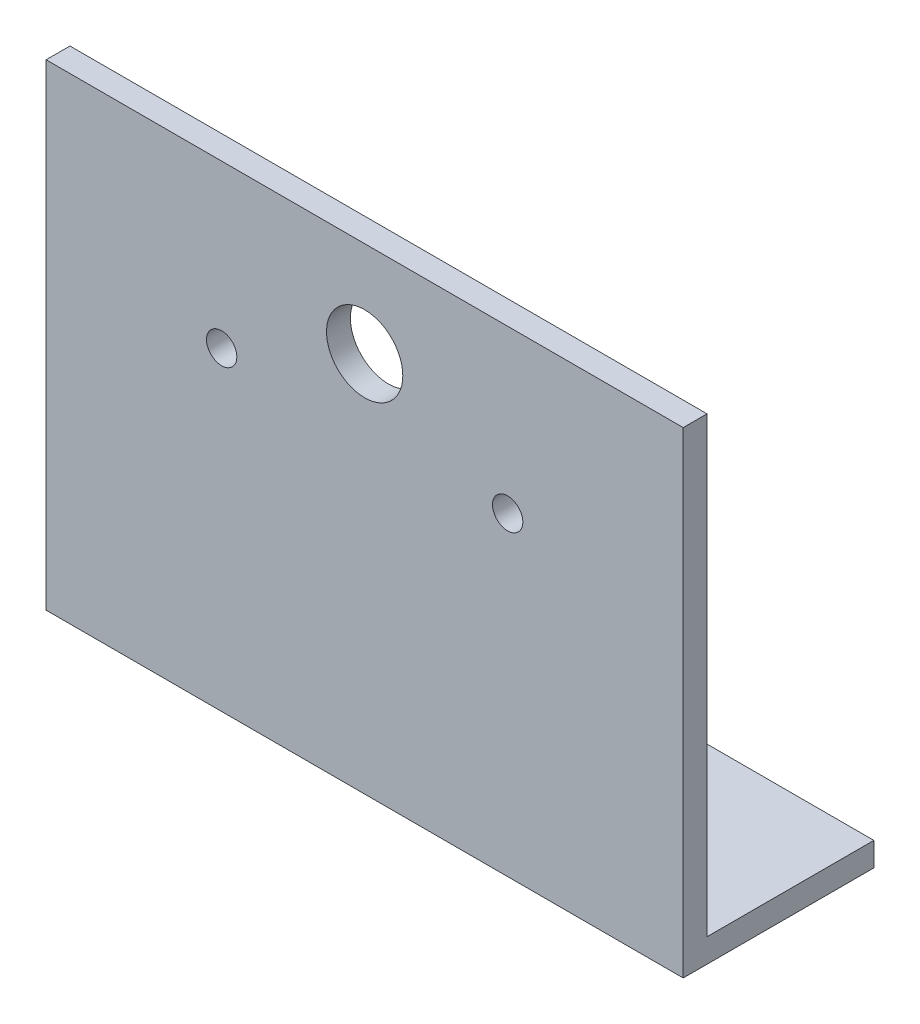
ISO-10303-21;
HEADER;
FILE_DESCRIPTION(('STEP AP214'),'2;1');
FILE_NAME('part.step','',(''),(''),'','','');
FILE_SCHEMA(('AUTOMOTIVE_DESIGN { 1 0 10303 214 1 1 1 1 }'));
ENDSEC;
DATA;
#1=APPLICATION_CONTEXT('core data for automotive mechanical design processes');
#2=APPLICATION_PROTOCOL_DEFINITION('international standard','automotive_design',2000,#1);
#3=PRODUCT_CONTEXT('',#1,'mechanical');
#4=PRODUCT('Part','Part','',(#3));
#5=PRODUCT_RELATED_PRODUCT_CATEGORY('part','',(#4));
#6=PRODUCT_DEFINITION_FORMATION('','',#4);
#7=PRODUCT_DEFINITION_CONTEXT('part definition',#1,'design');
#8=PRODUCT_DEFINITION('design','',#6,#7);
#9=PRODUCT_DEFINITION_SHAPE('','',#8);
#10=(LENGTH_UNIT() NAMED_UNIT(*) SI_UNIT(.MILLI.,.METRE.));
#11=(NAMED_UNIT(*) PLANE_ANGLE_UNIT() SI_UNIT($,.RADIAN.));
#12=(NAMED_UNIT(*) SI_UNIT($,.STERADIAN.) SOLID_ANGLE_UNIT());
#13=UNCERTAINTY_MEASURE_WITH_UNIT(LENGTH_MEASURE(1.E-05),#10,'distance_accuracy_value','');
#14=(GEOMETRIC_REPRESENTATION_CONTEXT(3) GLOBAL_UNCERTAINTY_ASSIGNED_CONTEXT((#13)) GLOBAL_UNIT_ASSIGNED_CONTEXT((#10,
#11,#12)) REPRESENTATION_CONTEXT('',''));
#15=CARTESIAN_POINT('',(0.,0.,0.));
#16=DIRECTION('',(0.,0.,1.));
#17=DIRECTION('',(1.,0.,0.));
#18=AXIS2_PLACEMENT_3D('',#15,#16,#17);
#19=CARTESIAN_POINT('',(-42.4334679946578,-41.91,3.175));
#20=DIRECTION('',(0.,0.,-1.));
#21=DIRECTION('',(-1.,0.,0.));
#22=AXIS2_PLACEMENT_3D('',#19,#20,#21);
#23=PLANE('',#22);
#24=CARTESIAN_POINT('',(19.05,0.,3.175));
#25=DIRECTION('',(0.,0.,1.));
#26=DIRECTION('',(1.,0.,0.));
#27=AXIS2_PLACEMENT_3D('',#24,#25,#26);
#28=CIRCLE('',#27,2.01929999999999);
#29=CARTESIAN_POINT('',(21.0693,0.,3.175));
#30=VERTEX_POINT('',#29);
#31=EDGE_CURVE('E131',#30,#30,#28,.T.);
#32=ORIENTED_EDGE('',*,*,#31,.F.);
#33=EDGE_LOOP('',(#32));
#34=FACE_BOUND('',#33,.T.);
#35=CARTESIAN_POINT('',(-19.05,0.,3.175));
#36=DIRECTION('',(0.,0.,1.));
#37=DIRECTION('',(1.,0.,0.));
#38=AXIS2_PLACEMENT_3D('',#35,#36,#37);
#39=CIRCLE('',#38,2.01929999999999);
#40=CARTESIAN_POINT('',(-17.0307,0.,3.175));
#41=VERTEX_POINT('',#40);
#42=EDGE_CURVE('E149',#41,#41,#39,.T.);
#43=ORIENTED_EDGE('',*,*,#42,.F.);
#44=EDGE_LOOP('',(#43));
#45=FACE_BOUND('',#44,.T.);
#46=DIRECTION('',(0.,-1.,0.));
#47=VECTOR('',#46,1.);
#48=CARTESIAN_POINT('',(-42.4334679946578,21.59,3.175));
#49=LINE('',#48,#47);
#50=CARTESIAN_POINT('',(-42.4334679946578,21.59,3.175));
#51=VERTEX_POINT('',#50);
#52=CARTESIAN_POINT('',(-42.4334679946578,-41.91,3.175));
#53=VERTEX_POINT('',#52);
#54=EDGE_CURVE('E163',#51,#53,#49,.T.);
#55=ORIENTED_EDGE('',*,*,#54,.T.);
#56=DIRECTION('',(1.,0.,0.));
#57=VECTOR('',#56,1.);
#58=CARTESIAN_POINT('',(42.4334679946578,-41.91,3.175));
#59=LINE('',#58,#57);
#60=CARTESIAN_POINT('',(42.4334679946578,-41.91,3.175));
#61=VERTEX_POINT('',#60);
#62=EDGE_CURVE('E83',#53,#61,#59,.T.);
#63=ORIENTED_EDGE('',*,*,#62,.T.);
#64=DIRECTION('',(0.,1.,0.));
#65=VECTOR('',#64,1.);
#66=CARTESIAN_POINT('',(42.4334679946578,21.59,3.175));
#67=LINE('',#66,#65);
#68=CARTESIAN_POINT('',(42.4334679946578,21.59,3.175));
#69=VERTEX_POINT('',#68);
#70=EDGE_CURVE('E105',#61,#69,#67,.T.);
#71=ORIENTED_EDGE('',*,*,#70,.T.);
#72=DIRECTION('',(-1.,0.,0.));
#73=VECTOR('',#72,1.);
#74=CARTESIAN_POINT('',(42.4334679946578,21.59,3.175));
#75=LINE('',#74,#73);
#76=EDGE_CURVE('E61',#69,#51,#75,.T.);
#77=ORIENTED_EDGE('',*,*,#76,.T.);
#78=EDGE_LOOP('',(#55,#63,#71,#77));
#79=FACE_BOUND('',#78,.T.);
#80=CARTESIAN_POINT('',(0.,8.89000000000001,3.175));
#81=DIRECTION('',(0.,0.,1.));
#82=DIRECTION('',(1.,0.,0.));
#83=AXIS2_PLACEMENT_3D('',#80,#81,#82);
#84=CIRCLE('',#83,5.08);
#85=CARTESIAN_POINT('',(5.07999999999999,8.89000000000001,3.175));
#86=VERTEX_POINT('',#85);
#87=EDGE_CURVE('E156',#86,#86,#84,.T.);
#88=ORIENTED_EDGE('',*,*,#87,.F.);
#89=EDGE_LOOP('',(#88));
#90=FACE_BOUND('',#89,.T.);
#91=ADVANCED_FACE('F35',(#34,#45,#79,#90),#23,.F.);
#92=CARTESIAN_POINT('',(-42.4334679946578,-41.91,0.));
#93=DIRECTION('',(0.,0.,-1.));
#94=DIRECTION('',(-1.,0.,0.));
#95=AXIS2_PLACEMENT_3D('',#92,#93,#94);
#96=PLANE('',#95);
#97=DIRECTION('',(1.,0.,0.));
#98=VECTOR('',#97,1.);
#99=CARTESIAN_POINT('',(42.4334679946578,-38.735,0.));
#100=LINE('',#99,#98);
#101=CARTESIAN_POINT('',(-42.4334679946578,-38.735,0.));
#102=VERTEX_POINT('',#101);
#103=CARTESIAN_POINT('',(42.4334679946578,-38.735,0.));
#104=VERTEX_POINT('',#103);
#105=EDGE_CURVE('E52',#102,#104,#100,.T.);
#106=ORIENTED_EDGE('',*,*,#105,.F.);
#107=DIRECTION('',(0.,-1.,0.));
#108=VECTOR('',#107,1.);
#109=CARTESIAN_POINT('',(-42.4334679946578,21.59,0.));
#110=LINE('',#109,#108);
#111=CARTESIAN_POINT('',(-42.4334679946578,21.59,0.));
#112=VERTEX_POINT('',#111);
#113=EDGE_CURVE('E159',#112,#102,#110,.T.);
#114=ORIENTED_EDGE('',*,*,#113,.F.);
#115=DIRECTION('',(-1.,0.,0.));
#116=VECTOR('',#115,1.);
#117=CARTESIAN_POINT('',(42.4334679946578,21.59,0.));
#118=LINE('',#117,#116);
#119=CARTESIAN_POINT('',(42.4334679946578,21.59,0.));
#120=VERTEX_POINT('',#119);
#121=EDGE_CURVE('E76',#120,#112,#118,.T.);
#122=ORIENTED_EDGE('',*,*,#121,.F.);
#123=DIRECTION('',(0.,1.,0.));
#124=VECTOR('',#123,1.);
#125=CARTESIAN_POINT('',(42.4334679946578,21.59,0.));
#126=LINE('',#125,#124);
#127=EDGE_CURVE('E135',#104,#120,#126,.T.);
#128=ORIENTED_EDGE('',*,*,#127,.F.);
#129=EDGE_LOOP('',(#106,#114,#122,#128));
#130=FACE_BOUND('',#129,.T.);
#131=CARTESIAN_POINT('',(19.05,0.,0.));
#132=DIRECTION('',(0.,0.,-1.));
#133=DIRECTION('',(-1.,0.,0.));
#134=AXIS2_PLACEMENT_3D('',#131,#132,#133);
#135=CIRCLE('',#134,2.01929999999999);
#136=CARTESIAN_POINT('',(17.0307,0.,0.));
#137=VERTEX_POINT('',#136);
#138=EDGE_CURVE('E145',#137,#137,#135,.T.);
#139=ORIENTED_EDGE('',*,*,#138,.F.);
#140=EDGE_LOOP('',(#139));
#141=FACE_BOUND('',#140,.T.);
#142=CARTESIAN_POINT('',(-19.05,0.,0.));
#143=DIRECTION('',(0.,0.,-1.));
#144=DIRECTION('',(-1.,0.,0.));
#145=AXIS2_PLACEMENT_3D('',#142,#143,#144);
#146=CIRCLE('',#145,2.01929999999999);
#147=CARTESIAN_POINT('',(-21.0693,0.,0.));
#148=VERTEX_POINT('',#147);
#149=EDGE_CURVE('E153',#148,#148,#146,.T.);
#150=ORIENTED_EDGE('',*,*,#149,.F.);
#151=EDGE_LOOP('',(#150));
#152=FACE_BOUND('',#151,.T.);
#153=CARTESIAN_POINT('',(0.,8.89000000000001,0.));
#154=DIRECTION('',(0.,0.,1.));
#155=DIRECTION('',(1.,0.,0.));
#156=AXIS2_PLACEMENT_3D('',#153,#154,#155);
#157=CIRCLE('',#156,5.08);
#158=CARTESIAN_POINT('',(5.07999999999999,8.89000000000001,0.));
#159=VERTEX_POINT('',#158);
#160=EDGE_CURVE('E160',#159,#159,#157,.T.);
#161=ORIENTED_EDGE('',*,*,#160,.T.);
#162=EDGE_LOOP('',(#161));
#163=FACE_BOUND('',#162,.T.);
#164=ADVANCED_FACE('F177',(#130,#141,#152,#163),#96,.T.);
#165=CARTESIAN_POINT('',(-42.4334679946578,21.59,3.175));
#166=DIRECTION('',(1.,0.,0.));
#167=DIRECTION('',(0.,1.,0.));
#168=AXIS2_PLACEMENT_3D('',#165,#166,#167);
#169=PLANE('',#168);
#170=ORIENTED_EDGE('',*,*,#113,.T.);
#171=DIRECTION('',(0.,0.,1.));
#172=VECTOR('',#171,1.);
#173=CARTESIAN_POINT('',(-42.4334679946578,-38.735,-22.225));
#174=LINE('',#173,#172);
#175=CARTESIAN_POINT('',(-42.4334679946578,-38.735,-22.225));
#176=VERTEX_POINT('',#175);
#177=EDGE_CURVE('E139',#176,#102,#174,.T.);
#178=ORIENTED_EDGE('',*,*,#177,.F.);
#179=DIRECTION('',(0.,1.,0.));
#180=VECTOR('',#179,1.);
#181=CARTESIAN_POINT('',(-42.4334679946578,-41.91,-22.225));
#182=LINE('',#181,#180);
#183=CARTESIAN_POINT('',(-42.4334679946578,-41.91,-22.225));
#184=VERTEX_POINT('',#183);
#185=EDGE_CURVE('E114',#184,#176,#182,.T.);
#186=ORIENTED_EDGE('',*,*,#185,.F.);
#187=DIRECTION('',(0.,0.,-1.));
#188=VECTOR('',#187,1.);
#189=CARTESIAN_POINT('',(-42.4334679946578,-41.91,3.175));
#190=LINE('',#189,#188);
#191=EDGE_CURVE('E11',#53,#184,#190,.T.);
#192=ORIENTED_EDGE('',*,*,#191,.F.);
#193=ORIENTED_EDGE('',*,*,#54,.F.);
#194=DIRECTION('',(0.,0.,-1.));
#195=VECTOR('',#194,1.);
#196=CARTESIAN_POINT('',(-42.4334679946578,21.59,3.175));
#197=LINE('',#196,#195);
#198=EDGE_CURVE('E168',#51,#112,#197,.T.);
#199=ORIENTED_EDGE('',*,*,#198,.T.);
#200=EDGE_LOOP('',(#170,#178,#186,#192,#193,#199));
#201=FACE_BOUND('',#200,.T.);
#202=ADVANCED_FACE('F37',(#201),#169,.F.);
#203=CARTESIAN_POINT('',(42.4334679946578,-41.91,3.175));
#204=DIRECTION('',(0.,1.,0.));
#205=DIRECTION('',(-1.,0.,0.));
#206=AXIS2_PLACEMENT_3D('',#203,#204,#205);
#207=PLANE('',#206);
#208=CARTESIAN_POINT('',(19.05,-41.91,-17.78));
#209=DIRECTION('',(0.,1.,0.));
#210=DIRECTION('',(-1.,0.,0.));
#211=AXIS2_PLACEMENT_3D('',#208,#209,#210);
#212=CIRCLE('',#211,2.01929999999999);
#213=CARTESIAN_POINT('',(17.0307,-41.91,-17.78));
#214=VERTEX_POINT('',#213);
#215=EDGE_CURVE('E212',#214,#214,#212,.T.);
#216=ORIENTED_EDGE('',*,*,#215,.T.);
#217=EDGE_LOOP('',(#216));
#218=FACE_BOUND('',#217,.T.);
#219=CARTESIAN_POINT('',(-19.05,-41.91,-17.78));
#220=DIRECTION('',(0.,1.,0.));
#221=DIRECTION('',(-1.,0.,0.));
#222=AXIS2_PLACEMENT_3D('',#219,#220,#221);
#223=CIRCLE('',#222,2.01929999999999);
#224=CARTESIAN_POINT('',(-21.0693,-41.91,-17.78));
#225=VERTEX_POINT('',#224);
#226=EDGE_CURVE('E121',#225,#225,#223,.T.);
#227=ORIENTED_EDGE('',*,*,#226,.T.);
#228=EDGE_LOOP('',(#227));
#229=FACE_BOUND('',#228,.T.);
#230=ORIENTED_EDGE('',*,*,#191,.T.);
#231=DIRECTION('',(-1.,0.,0.));
#232=VECTOR('',#231,1.);
#233=CARTESIAN_POINT('',(42.4334679946578,-41.91,-22.225));
#234=LINE('',#233,#232);
#235=CARTESIAN_POINT('',(42.4334679946578,-41.91,-22.225));
#236=VERTEX_POINT('',#235);
#237=EDGE_CURVE('E109',#236,#184,#234,.T.);
#238=ORIENTED_EDGE('',*,*,#237,.F.);
#239=DIRECTION('',(0.,0.,-1.));
#240=VECTOR('',#239,1.);
#241=CARTESIAN_POINT('',(42.4334679946578,-41.91,3.175));
#242=LINE('',#241,#240);
#243=EDGE_CURVE('E44',#61,#236,#242,.T.);
#244=ORIENTED_EDGE('',*,*,#243,.F.);
#245=ORIENTED_EDGE('',*,*,#62,.F.);
#246=EDGE_LOOP('',(#230,#238,#244,#245));
#247=FACE_BOUND('',#246,.T.);
#248=ADVANCED_FACE('F110',(#218,#229,#247),#207,.F.);
#249=CARTESIAN_POINT('',(42.4334679946578,21.59,3.175));
#250=DIRECTION('',(-1.,0.,0.));
#251=DIRECTION('',(0.,-1.,0.));
#252=AXIS2_PLACEMENT_3D('',#249,#250,#251);
#253=PLANE('',#252);
#254=ORIENTED_EDGE('',*,*,#243,.T.);
#255=DIRECTION('',(0.,-1.,0.));
#256=VECTOR('',#255,1.);
#257=CARTESIAN_POINT('',(42.4334679946578,-41.91,-22.225));
#258=LINE('',#257,#256);
#259=CARTESIAN_POINT('',(42.4334679946578,-38.735,-22.225));
#260=VERTEX_POINT('',#259);
#261=EDGE_CURVE('E103',#260,#236,#258,.T.);
#262=ORIENTED_EDGE('',*,*,#261,.F.);
#263=DIRECTION('',(0.,0.,1.));
#264=VECTOR('',#263,1.);
#265=CARTESIAN_POINT('',(42.4334679946578,-38.735,-22.225));
#266=LINE('',#265,#264);
#267=EDGE_CURVE('E128',#260,#104,#266,.T.);
#268=ORIENTED_EDGE('',*,*,#267,.T.);
#269=ORIENTED_EDGE('',*,*,#127,.T.);
#270=DIRECTION('',(0.,0.,-1.));
#271=VECTOR('',#270,1.);
#272=CARTESIAN_POINT('',(42.4334679946578,21.59,3.175));
#273=LINE('',#272,#271);
#274=EDGE_CURVE('E106',#69,#120,#273,.T.);
#275=ORIENTED_EDGE('',*,*,#274,.F.);
#276=ORIENTED_EDGE('',*,*,#70,.F.);
#277=EDGE_LOOP('',(#254,#262,#268,#269,#275,#276));
#278=FACE_BOUND('',#277,.T.);
#279=ADVANCED_FACE('F100',(#278),#253,.F.);
#280=CARTESIAN_POINT('',(42.4334679946578,21.59,3.175));
#281=DIRECTION('',(0.,-1.,0.));
#282=DIRECTION('',(1.,0.,0.));
#283=AXIS2_PLACEMENT_3D('',#280,#281,#282);
#284=PLANE('',#283);
#285=ORIENTED_EDGE('',*,*,#121,.T.);
#286=ORIENTED_EDGE('',*,*,#198,.F.);
#287=ORIENTED_EDGE('',*,*,#76,.F.);
#288=ORIENTED_EDGE('',*,*,#274,.T.);
#289=EDGE_LOOP('',(#285,#286,#287,#288));
#290=FACE_BOUND('',#289,.T.);
#291=ADVANCED_FACE('F176',(#290),#284,.F.);
#292=CARTESIAN_POINT('',(0.,8.89000000000001,3.175));
#293=DIRECTION('',(0.,0.,-1.));
#294=DIRECTION('',(-1.,0.,0.));
#295=AXIS2_PLACEMENT_3D('',#292,#293,#294);
#296=CYLINDRICAL_SURFACE('',#295,5.08);
#297=ORIENTED_EDGE('',*,*,#87,.T.);
#298=EDGE_LOOP('',(#297));
#299=FACE_BOUND('',#298,.T.);
#300=ORIENTED_EDGE('',*,*,#160,.F.);
#301=EDGE_LOOP('',(#300));
#302=FACE_BOUND('',#301,.T.);
#303=ADVANCED_FACE('F187',(#299,#302),#296,.F.);
#304=CARTESIAN_POINT('',(-19.05,0.,3.175));
#305=DIRECTION('',(0.,0.,1.));
#306=DIRECTION('',(1.,0.,0.));
#307=AXIS2_PLACEMENT_3D('',#304,#305,#306);
#308=CYLINDRICAL_SURFACE('',#307,2.01929999999999);
#309=ORIENTED_EDGE('',*,*,#149,.T.);
#310=EDGE_LOOP('',(#309));
#311=FACE_BOUND('',#310,.T.);
#312=ORIENTED_EDGE('',*,*,#42,.T.);
#313=EDGE_LOOP('',(#312));
#314=FACE_BOUND('',#313,.T.);
#315=ADVANCED_FACE('F190',(#311,#314),#308,.F.);
#316=CARTESIAN_POINT('',(19.05,0.,3.175));
#317=DIRECTION('',(0.,0.,1.));
#318=DIRECTION('',(1.,0.,0.));
#319=AXIS2_PLACEMENT_3D('',#316,#317,#318);
#320=CYLINDRICAL_SURFACE('',#319,2.01929999999999);
#321=ORIENTED_EDGE('',*,*,#138,.T.);
#322=EDGE_LOOP('',(#321));
#323=FACE_BOUND('',#322,.T.);
#324=ORIENTED_EDGE('',*,*,#31,.T.);
#325=EDGE_LOOP('',(#324));
#326=FACE_BOUND('',#325,.T.);
#327=ADVANCED_FACE('F232',(#323,#326),#320,.F.);
#328=CARTESIAN_POINT('',(42.4334679946578,-38.735,-22.225));
#329=DIRECTION('',(0.,-1.,0.));
#330=DIRECTION('',(0.,0.,-1.));
#331=AXIS2_PLACEMENT_3D('',#328,#329,#330);
#332=PLANE('',#331);
#333=CARTESIAN_POINT('',(19.05,-38.735,-17.78));
#334=DIRECTION('',(0.,1.,0.));
#335=DIRECTION('',(0.,0.,1.));
#336=AXIS2_PLACEMENT_3D('',#333,#334,#335);
#337=CIRCLE('',#336,2.01929999999999);
#338=CARTESIAN_POINT('',(19.05,-38.735,-15.7607));
#339=VERTEX_POINT('',#338);
#340=EDGE_CURVE('E220',#339,#339,#337,.T.);
#341=ORIENTED_EDGE('',*,*,#340,.F.);
#342=EDGE_LOOP('',(#341));
#343=FACE_BOUND('',#342,.T.);
#344=CARTESIAN_POINT('',(-19.05,-38.735,-17.78));
#345=DIRECTION('',(0.,1.,0.));
#346=DIRECTION('',(0.,0.,1.));
#347=AXIS2_PLACEMENT_3D('',#344,#345,#346);
#348=CIRCLE('',#347,2.01929999999999);
#349=CARTESIAN_POINT('',(-19.05,-38.735,-15.7607));
#350=VERTEX_POINT('',#349);
#351=EDGE_CURVE('E216',#350,#350,#348,.T.);
#352=ORIENTED_EDGE('',*,*,#351,.F.);
#353=EDGE_LOOP('',(#352));
#354=FACE_BOUND('',#353,.T.);
#355=ORIENTED_EDGE('',*,*,#105,.T.);
#356=ORIENTED_EDGE('',*,*,#267,.F.);
#357=DIRECTION('',(1.,0.,0.));
#358=VECTOR('',#357,1.);
#359=CARTESIAN_POINT('',(42.4334679946578,-38.735,-22.225));
#360=LINE('',#359,#358);
#361=EDGE_CURVE('E118',#176,#260,#360,.T.);
#362=ORIENTED_EDGE('',*,*,#361,.F.);
#363=ORIENTED_EDGE('',*,*,#177,.T.);
#364=EDGE_LOOP('',(#355,#356,#362,#363));
#365=FACE_BOUND('',#364,.T.);
#366=ADVANCED_FACE('F229',(#343,#354,#365),#332,.F.);
#367=CARTESIAN_POINT('',(42.4334679946578,-38.735,-22.225));
#368=DIRECTION('',(0.,0.,1.));
#369=DIRECTION('',(1.,0.,0.));
#370=AXIS2_PLACEMENT_3D('',#367,#368,#369);
#371=PLANE('',#370);
#372=ORIENTED_EDGE('',*,*,#261,.T.);
#373=ORIENTED_EDGE('',*,*,#237,.T.);
#374=ORIENTED_EDGE('',*,*,#185,.T.);
#375=ORIENTED_EDGE('',*,*,#361,.T.);
#376=EDGE_LOOP('',(#372,#373,#374,#375));
#377=FACE_BOUND('',#376,.T.);
#378=ADVANCED_FACE('F116',(#377),#371,.F.);
#379=CARTESIAN_POINT('',(-19.05,-38.735,-17.78));
#380=DIRECTION('',(0.,1.,0.));
#381=DIRECTION('',(0.,0.,1.));
#382=AXIS2_PLACEMENT_3D('',#379,#380,#381);
#383=CYLINDRICAL_SURFACE('',#382,2.01929999999999);
#384=ORIENTED_EDGE('',*,*,#351,.T.);
#385=EDGE_LOOP('',(#384));
#386=FACE_BOUND('',#385,.T.);
#387=ORIENTED_EDGE('',*,*,#226,.F.);
#388=EDGE_LOOP('',(#387));
#389=FACE_BOUND('',#388,.T.);
#390=ADVANCED_FACE('F237',(#386,#389),#383,.F.);
#391=CARTESIAN_POINT('',(19.05,-38.735,-17.78));
#392=DIRECTION('',(0.,1.,0.));
#393=DIRECTION('',(0.,0.,1.));
#394=AXIS2_PLACEMENT_3D('',#391,#392,#393);
#395=CYLINDRICAL_SURFACE('',#394,2.01929999999999);
#396=ORIENTED_EDGE('',*,*,#340,.T.);
#397=EDGE_LOOP('',(#396));
#398=FACE_BOUND('',#397,.T.);
#399=ORIENTED_EDGE('',*,*,#215,.F.);
#400=EDGE_LOOP('',(#399));
#401=FACE_BOUND('',#400,.T.);
#402=ADVANCED_FACE('F226',(#398,#401),#395,.F.);
#403=CLOSED_SHELL('',(#91,#164,#202,#248,#279,#291,#303,#315,#327,#366,#378,#390,#402));
#404=MANIFOLD_SOLID_BREP('B2',#403);
#405=ADVANCED_BREP_SHAPE_REPRESENTATION('',(#18,#404),#14);
#406=SHAPE_DEFINITION_REPRESENTATION(#9,#405);
ENDSEC;
END-ISO-10303-21;
